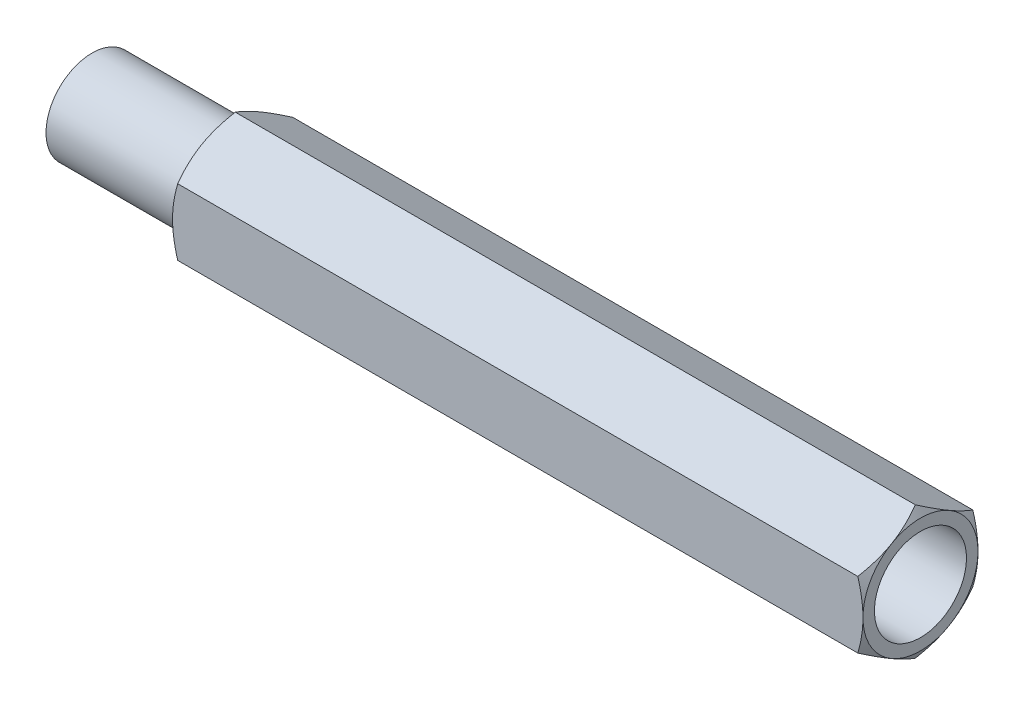
ISO-10303-21;
HEADER;
FILE_DESCRIPTION(('STEP AP214'),'2;1');
FILE_NAME('part.step','',(''),(''),'','','');
FILE_SCHEMA(('AUTOMOTIVE_DESIGN { 1 0 10303 214 1 1 1 1 }'));
ENDSEC;
DATA;
#1=APPLICATION_CONTEXT('core data for automotive mechanical design processes');
#2=APPLICATION_PROTOCOL_DEFINITION('international standard','automotive_design',2000,#1);
#3=PRODUCT_CONTEXT('',#1,'mechanical');
#4=PRODUCT('Part','Part','',(#3));
#5=PRODUCT_RELATED_PRODUCT_CATEGORY('part','',(#4));
#6=PRODUCT_DEFINITION_FORMATION('','',#4);
#7=PRODUCT_DEFINITION_CONTEXT('part definition',#1,'design');
#8=PRODUCT_DEFINITION('design','',#6,#7);
#9=PRODUCT_DEFINITION_SHAPE('','',#8);
#10=(LENGTH_UNIT() NAMED_UNIT(*) SI_UNIT(.MILLI.,.METRE.));
#11=(NAMED_UNIT(*) PLANE_ANGLE_UNIT() SI_UNIT($,.RADIAN.));
#12=(NAMED_UNIT(*) SI_UNIT($,.STERADIAN.) SOLID_ANGLE_UNIT());
#13=UNCERTAINTY_MEASURE_WITH_UNIT(LENGTH_MEASURE(1.E-05),#10,'distance_accuracy_value','');
#14=(GEOMETRIC_REPRESENTATION_CONTEXT(3) GLOBAL_UNCERTAINTY_ASSIGNED_CONTEXT((#13)) GLOBAL_UNIT_ASSIGNED_CONTEXT((#10,
#11,#12)) REPRESENTATION_CONTEXT('',''));
#15=CARTESIAN_POINT('',(0.,0.,0.));
#16=DIRECTION('',(0.,0.,1.));
#17=DIRECTION('',(1.,0.,0.));
#18=AXIS2_PLACEMENT_3D('',#15,#16,#17);
#19=CARTESIAN_POINT('',(6.,1.44337567297408,-2.5));
#20=DIRECTION('',(1.,0.,0.));
#21=DIRECTION('',(0.,0.,-1.));
#22=AXIS2_PLACEMENT_3D('',#19,#20,#21);
#23=PLANE('',#22);
#24=CARTESIAN_POINT('',(6.,0.,0.));
#25=DIRECTION('',(1.,0.,0.));
#26=DIRECTION('',(0.,0.,-1.));
#27=AXIS2_PLACEMENT_3D('',#24,#25,#26);
#28=CIRCLE('',#27,2.5);
#29=CARTESIAN_POINT('',(6.,0.,-2.5));
#30=VERTEX_POINT('',#29);
#31=CARTESIAN_POINT('',(6.,2.1650635094611,-1.24999999999999));
#32=VERTEX_POINT('',#31);
#33=EDGE_CURVE('E267',#30,#32,#28,.T.);
#34=ORIENTED_EDGE('',*,*,#33,.F.);
#35=CARTESIAN_POINT('',(6.,-2.1650635094611,-1.25));
#36=VERTEX_POINT('',#35);
#37=EDGE_CURVE('E268',#36,#30,#28,.T.);
#38=ORIENTED_EDGE('',*,*,#37,.F.);
#39=CARTESIAN_POINT('',(6.,-2.1650635094611,1.25));
#40=VERTEX_POINT('',#39);
#41=EDGE_CURVE('E266',#40,#36,#28,.T.);
#42=ORIENTED_EDGE('',*,*,#41,.F.);
#43=CARTESIAN_POINT('',(6.,0.,2.5));
#44=VERTEX_POINT('',#43);
#45=EDGE_CURVE('E279',#44,#40,#28,.T.);
#46=ORIENTED_EDGE('',*,*,#45,.F.);
#47=CARTESIAN_POINT('',(6.,0.,0.));
#48=DIRECTION('',(-1.,0.,0.));
#49=DIRECTION('',(0.,0.,1.));
#50=AXIS2_PLACEMENT_3D('',#47,#48,#49);
#51=CIRCLE('',#50,2.5);
#52=CARTESIAN_POINT('',(6.,2.1650635094611,1.25));
#53=VERTEX_POINT('',#52);
#54=EDGE_CURVE('E303',#44,#53,#51,.T.);
#55=ORIENTED_EDGE('',*,*,#54,.T.);
#56=EDGE_CURVE('E275',#32,#53,#28,.T.);
#57=ORIENTED_EDGE('',*,*,#56,.F.);
#58=EDGE_LOOP('',(#34,#38,#42,#46,#55,#57));
#59=FACE_BOUND('',#58,.T.);
#60=CARTESIAN_POINT('',(6.,0.,0.));
#61=DIRECTION('',(1.,0.,0.));
#62=DIRECTION('',(0.,0.,-1.));
#63=AXIS2_PLACEMENT_3D('',#60,#61,#62);
#64=CIRCLE('',#63,2.);
#65=CARTESIAN_POINT('',(6.,0.,-2.));
#66=VERTEX_POINT('',#65);
#67=EDGE_CURVE('E11',#66,#66,#64,.F.);
#68=ORIENTED_EDGE('',*,*,#67,.F.);
#69=EDGE_LOOP('',(#68));
#70=FACE_BOUND('',#69,.T.);
#71=ADVANCED_FACE('F40',(#59,#70),#23,.F.);
#72=CARTESIAN_POINT('',(36.,-1.44337567297407,-2.5));
#73=DIRECTION('',(0.,0.,1.));
#74=DIRECTION('',(0.,-1.,0.));
#75=AXIS2_PLACEMENT_3D('',#72,#73,#74);
#76=PLANE('',#75);
#77=CARTESIAN_POINT('',(34.7508787691137,-3.93682851187262,-2.5));
#78=CARTESIAN_POINT('',(34.8043404567659,-3.82710818909763,-2.5));
#79=CARTESIAN_POINT('',(34.8573064813436,-3.71714229485296,-2.5));
#80=CARTESIAN_POINT('',(34.9619695344395,-3.49658896480046,-2.5));
#81=CARTESIAN_POINT('',(35.0136663739622,-3.3860014394022,-2.5));
#82=CARTESIAN_POINT('',(35.115760761975,-3.16353296518395,-2.5));
#83=CARTESIAN_POINT('',(35.1661502063801,-3.05164828484383,-2.5));
#84=CARTESIAN_POINT('',(35.264944892168,-2.82700953689334,-2.5));
#85=CARTESIAN_POINT('',(35.3133502235222,-2.71425550898044,-2.5));
#86=CARTESIAN_POINT('',(35.409250530731,-2.48386509338641,-2.5));
#87=CARTESIAN_POINT('',(35.4566592576203,-2.36619261390428,-2.5));
#88=CARTESIAN_POINT('',(35.5480311496517,-2.12949325098224,-2.5));
#89=CARTESIAN_POINT('',(35.5919939367007,-2.01046622055543,-2.5));
#90=CARTESIAN_POINT('',(35.675363617727,-1.77107239298566,-2.5));
#91=CARTESIAN_POINT('',(35.7147792341367,-1.65070866329632,-2.5));
#92=CARTESIAN_POINT('',(35.787829554951,-1.40825562875043,-2.5));
#93=CARTESIAN_POINT('',(35.821466017572,-1.28616686098639,-2.5));
#94=CARTESIAN_POINT('',(35.881205191497,-1.0408697817303,-2.5));
#95=CARTESIAN_POINT('',(35.9073500479934,-0.917671922372913,-2.5));
#96=CARTESIAN_POINT('',(35.9506668258636,-0.669683589080242,-2.5));
#97=CARTESIAN_POINT('',(35.9678397230119,-0.544893289848821,-2.5));
#98=CARTESIAN_POINT('',(35.9916208578148,-0.295997325613061,-2.5));
#99=CARTESIAN_POINT('',(35.9983695673072,-0.171905422417135,-2.5));
#100=CARTESIAN_POINT('',(36.0011039761235,0.0764102585415243,-2.5));
#101=CARTESIAN_POINT('',(35.9970895167612,0.200634038221578,-2.5));
#102=CARTESIAN_POINT('',(35.9815599959649,0.409769808352732,-2.5));
#103=CARTESIAN_POINT('',(35.9727646525366,0.494897467609097,-2.5));
#104=CARTESIAN_POINT('',(35.9506354089981,0.664564693702991,-2.5));
#105=CARTESIAN_POINT('',(35.9373009427098,0.749104185833703,-2.5));
#106=CARTESIAN_POINT('',(35.8911861462596,1.00170586449879,-2.5));
#107=CARTESIAN_POINT('',(35.8523014542741,1.16866798504123,-2.5));
#108=CARTESIAN_POINT('',(35.7844155339125,1.41845743278139,-2.5));
#109=CARTESIAN_POINT('',(35.7598568023056,1.50256614631934,-2.5));
#110=CARTESIAN_POINT('',(35.708075553247,1.6699675205386,-2.5));
#111=CARTESIAN_POINT('',(35.6808530152469,1.75326017491942,-2.49999999999999));
#112=CARTESIAN_POINT('',(35.6241903573808,1.91905463328519,-2.49999999999999));
#113=CARTESIAN_POINT('',(35.5947508613032,2.00155665242186,-2.49999999999999));
#114=CARTESIAN_POINT('',(35.5340119127324,2.16586873031761,-2.49999999999999));
#115=CARTESIAN_POINT('',(35.5027125029679,2.24767880492379,-2.49999999999999));
#116=CARTESIAN_POINT('',(35.4160096449457,2.4679917892095,-2.49999999999999));
#117=CARTESIAN_POINT('',(35.3591311532434,2.60591366383172,-2.49999999999999));
#118=CARTESIAN_POINT('',(35.2420273288296,2.88033446959211,-2.49999999999999));
#119=CARTESIAN_POINT('',(35.1818016232289,3.01683324017273,-2.49999999999999));
#120=CARTESIAN_POINT('',(35.0587995600523,3.28873049385052,-2.49999999999999));
#121=CARTESIAN_POINT('',(34.9960223163594,3.42412857476063,-2.49999999999999));
#122=CARTESIAN_POINT('',(34.868517492058,3.69400504169936,-2.49999999999999));
#123=CARTESIAN_POINT('',(34.8037898513421,3.82848339922683,-2.49999999999999));
#124=CARTESIAN_POINT('',(34.6071430409521,4.23123577525371,-2.49999999999999));
#125=CARTESIAN_POINT('',(34.472956234217,4.49840113812902,-2.49999999999999));
#126=CARTESIAN_POINT('',(34.200798503918,5.03071112955916,-2.49999999999999));
#127=CARTESIAN_POINT('',(34.0628283826684,5.29585617154695,-2.49999999999999));
#128=CARTESIAN_POINT('',(33.7990641263008,5.79675686803829,-2.49999999999999));
#129=CARTESIAN_POINT('',(33.6735291788985,6.03264924061411,-2.49999999999999));
#130=CARTESIAN_POINT('',(33.4209486180911,6.50364132654159,-2.49999999999999));
#131=CARTESIAN_POINT('',(33.2939029113505,6.73874098975548,-2.49999999999999));
#132=CARTESIAN_POINT('',(33.0391210110359,7.20754017895845,-2.49999999999999));
#133=CARTESIAN_POINT('',(32.9113885830859,7.44124175390128,-2.49999999999999));
#134=CARTESIAN_POINT('',(32.6550655132235,7.90814984607043,-2.49999999999999));
#135=CARTESIAN_POINT('',(32.5264749402216,8.14135640111172,-2.49999999999999));
#136=CARTESIAN_POINT('',(32.3975723438962,8.37438915427277,-2.49999999999999));
#137=B_SPLINE_CURVE_WITH_KNOTS('',3,(#77,#78,#79,#80,#81,#82,#83,#84,#85,#86,#87,#88,#89,#90,
#91,#92,#93,#94,#95,#96,#97,#98,#99,#100,#101,#102,#103,#104,#105,#106,#107,#108,#109,#110,#111,
#112,#113,#114,#115,#116,#117,#118,#119,#120,#121,#122,#123,#124,#125,#126,#127,#128,#129,#130,
#131,#132,#133,#134,#135,#136),.UNSPECIFIED.,.F.,.F.,(4,2,2,2,2,2,2,2,2,2,2,2,2,2,2,2,2,2,2,2,2,
2,2,2,2,2,2,2,2,4),(0.,0.366160325892052,0.732374850327399,1.10048369240865,1.46857582373929,
1.84912519359739,2.22971625955537,2.60956468599492,2.98929734412778,3.36684982144535,
3.74436122826867,4.11673964760972,4.48912355711763,4.74574269795127,5.00239385938625,
5.51594573005896,5.77878421499915,6.04162472762437,6.30439155881506,6.5671523556674,
7.01465571548672,7.46220902877876,7.90991912245572,8.35764302784629,9.25449744046324,
10.1511631091372,10.9528027044398,11.7544920854069,12.5534819307734,13.3524083699507),.UNSPECIFIED.);
#138=CARTESIAN_POINT('',(35.7767090063074,-1.44337567297407,-2.5));
#139=VERTEX_POINT('',#138);
#140=CARTESIAN_POINT('',(36.,0.,-2.5));
#141=VERTEX_POINT('',#140);
#142=EDGE_CURVE('E304',#139,#141,#137,.T.);
#143=ORIENTED_EDGE('',*,*,#142,.F.);
#144=DIRECTION('',(-1.,0.,0.));
#145=VECTOR('',#144,1.);
#146=CARTESIAN_POINT('',(36.,-1.44337567297407,-2.5));
#147=LINE('',#146,#145);
#148=CARTESIAN_POINT('',(6.2232909936926,-1.44337567297407,-2.5));
#149=VERTEX_POINT('',#148);
#150=EDGE_CURVE('E253',#139,#149,#147,.T.);
#151=ORIENTED_EDGE('',*,*,#150,.T.);
#152=CARTESIAN_POINT('',(7.24912123088631,-3.93682851187262,-2.5));
#153=CARTESIAN_POINT('',(7.19565954323411,-3.82710818909763,-2.5));
#154=CARTESIAN_POINT('',(7.14269351865644,-3.71714229485297,-2.5));
#155=CARTESIAN_POINT('',(7.03803046556053,-3.49658896480046,-2.5));
#156=CARTESIAN_POINT('',(6.98633362603778,-3.3860014394022,-2.5));
#157=CARTESIAN_POINT('',(6.88423923802502,-3.16353296518396,-2.5));
#158=CARTESIAN_POINT('',(6.8338497936199,-3.05164828484383,-2.5));
#159=CARTESIAN_POINT('',(6.735055107832,-2.82700953689334,-2.5));
#160=CARTESIAN_POINT('',(6.68664977647774,-2.71425550898045,-2.5));
#161=CARTESIAN_POINT('',(6.59074946926901,-2.48386509338642,-2.5));
#162=CARTESIAN_POINT('',(6.54334074237968,-2.36619261390429,-2.5));
#163=CARTESIAN_POINT('',(6.45196885034827,-2.12949325098224,-2.5));
#164=CARTESIAN_POINT('',(6.40800606329925,-2.01046622055544,-2.5));
#165=CARTESIAN_POINT('',(6.32463638227302,-1.77107239298566,-2.5));
#166=CARTESIAN_POINT('',(6.28522076586331,-1.65070866329632,-2.5));
#167=CARTESIAN_POINT('',(6.21217044504895,-1.40825562875043,-2.5));
#168=CARTESIAN_POINT('',(6.17853398242803,-1.28616686098639,-2.5));
#169=CARTESIAN_POINT('',(6.11879480850298,-1.0408697817303,-2.5));
#170=CARTESIAN_POINT('',(6.09264995200663,-0.917671922372913,-2.5));
#171=CARTESIAN_POINT('',(6.04933317413643,-0.669683589080243,-2.5));
#172=CARTESIAN_POINT('',(6.0321602769881,-0.544893289848822,-2.5));
#173=CARTESIAN_POINT('',(6.00837914218523,-0.295997325613063,-2.5));
#174=CARTESIAN_POINT('',(6.00163043269274,-0.171905422417137,-2.5));
#175=CARTESIAN_POINT('',(5.9988960238765,0.0764102585415225,-2.5));
#176=CARTESIAN_POINT('',(6.00291048323881,0.200634038221577,-2.5));
#177=CARTESIAN_POINT('',(6.01844000403505,0.40976980835273,-2.5));
#178=CARTESIAN_POINT('',(6.02723534746341,0.494897467609095,-2.5));
#179=CARTESIAN_POINT('',(6.04936459100185,0.66456469370299,-2.5));
#180=CARTESIAN_POINT('',(6.06269905729015,0.749104185833701,-2.5));
#181=CARTESIAN_POINT('',(6.10881385374036,1.00170586449879,-2.5));
#182=CARTESIAN_POINT('',(6.14769854572585,1.16866798504122,-2.5));
#183=CARTESIAN_POINT('',(6.21558446608752,1.41845743278139,-2.5));
#184=CARTESIAN_POINT('',(6.24014319769442,1.50256614631933,-2.5));
#185=CARTESIAN_POINT('',(6.29192444675296,1.6699675205386,-2.5));
#186=CARTESIAN_POINT('',(6.31914698475308,1.75326017491942,-2.49999999999999));
#187=CARTESIAN_POINT('',(6.37580964261923,1.91905463328519,-2.49999999999999));
#188=CARTESIAN_POINT('',(6.40524913869675,2.00155665242186,-2.49999999999999));
#189=CARTESIAN_POINT('',(6.46598808726755,2.16586873031761,-2.49999999999999));
#190=CARTESIAN_POINT('',(6.49728749703213,2.24767880492379,-2.49999999999999));
#191=CARTESIAN_POINT('',(6.58399035505426,2.4679917892095,-2.49999999999999));
#192=CARTESIAN_POINT('',(6.64086884675663,2.60591366383172,-2.49999999999999));
#193=CARTESIAN_POINT('',(6.75797267117043,2.88033446959211,-2.49999999999999));
#194=CARTESIAN_POINT('',(6.81819837677106,3.01683324017274,-2.49999999999999));
#195=CARTESIAN_POINT('',(6.94120043994772,3.28873049385052,-2.49999999999999));
#196=CARTESIAN_POINT('',(7.00397768364063,3.42412857476063,-2.49999999999999));
#197=CARTESIAN_POINT('',(7.13148250794196,3.69400504169936,-2.49999999999999));
#198=CARTESIAN_POINT('',(7.1962101486579,3.82848339922683,-2.49999999999999));
#199=CARTESIAN_POINT('',(7.39285695904792,4.23123577525371,-2.49999999999999));
#200=CARTESIAN_POINT('',(7.52704376578296,4.49840113812902,-2.49999999999999));
#201=CARTESIAN_POINT('',(7.79920149608202,5.03071112955915,-2.49999999999999));
#202=CARTESIAN_POINT('',(7.93717161733164,5.29585617154695,-2.49999999999999));
#203=CARTESIAN_POINT('',(8.20093587369918,5.79675686803829,-2.49999999999999));
#204=CARTESIAN_POINT('',(8.32647082110146,6.03264924061411,-2.49999999999999));
#205=CARTESIAN_POINT('',(8.57905138190891,6.50364132654159,-2.49999999999999));
#206=CARTESIAN_POINT('',(8.70609708864949,6.73874098975547,-2.49999999999999));
#207=CARTESIAN_POINT('',(8.9608789889641,7.20754017895844,-2.49999999999999));
#208=CARTESIAN_POINT('',(9.08861141691406,7.44124175390128,-2.49999999999999));
#209=CARTESIAN_POINT('',(9.34493448677647,7.90814984607042,-2.49999999999999));
#210=CARTESIAN_POINT('',(9.4735250597784,8.14135640111172,-2.49999999999999));
#211=CARTESIAN_POINT('',(9.60242765610383,8.37438915427277,-2.49999999999999));
#212=B_SPLINE_CURVE_WITH_KNOTS('',3,(#152,#153,#154,#155,#156,#157,#158,#159,#160,#161,#162,
#163,#164,#165,#166,#167,#168,#169,#170,#171,#172,#173,#174,#175,#176,#177,#178,#179,#180,#181,
#182,#183,#184,#185,#186,#187,#188,#189,#190,#191,#192,#193,#194,#195,#196,#197,#198,#199,#200,
#201,#202,#203,#204,#205,#206,#207,#208,#209,#210,#211),.UNSPECIFIED.,.F.,.F.,(4,2,2,2,2,2,2,2,
2,2,2,2,2,2,2,2,2,2,2,2,2,2,2,2,2,2,2,2,2,4),(0.,0.36616032589205,0.732374850327399,
1.10048369240865,1.46857582373929,1.84912519359739,2.22971625955537,2.60956468599492,
2.98929734412778,3.36684982144535,3.74436122826867,4.11673964760972,4.48912355711763,
4.74574269795127,5.00239385938625,5.51594573005896,5.77878421499915,6.04162472762437,
6.30439155881506,6.5671523556674,7.01465571548672,7.46220902877876,7.90991912245572,
8.35764302784629,9.25449744046324,10.1511631091372,10.9528027044398,11.7544920854069,
12.5534819307734,13.3524083699507),.UNSPECIFIED.);
#213=EDGE_CURVE('E234',#30,#149,#212,.F.);
#214=ORIENTED_EDGE('',*,*,#213,.F.);
#215=CARTESIAN_POINT('',(6.2232909936926,1.44337567297408,-2.5));
#216=VERTEX_POINT('',#215);
#217=EDGE_CURVE('E476',#216,#30,#212,.F.);
#218=ORIENTED_EDGE('',*,*,#217,.F.);
#219=DIRECTION('',(-1.,0.,0.));
#220=VECTOR('',#219,1.);
#221=CARTESIAN_POINT('',(36.,1.44337567297408,-2.5));
#222=LINE('',#221,#220);
#223=CARTESIAN_POINT('',(35.7767090063074,1.44337567297408,-2.5));
#224=VERTEX_POINT('',#223);
#225=EDGE_CURVE('E263',#224,#216,#222,.T.);
#226=ORIENTED_EDGE('',*,*,#225,.F.);
#227=EDGE_CURVE('E131',#141,#224,#137,.T.);
#228=ORIENTED_EDGE('',*,*,#227,.F.);
#229=EDGE_LOOP('',(#143,#151,#214,#218,#226,#228));
#230=FACE_BOUND('',#229,.T.);
#231=ADVANCED_FACE('F39',(#230),#76,.F.);
#232=CARTESIAN_POINT('',(36.,1.44337567297408,-2.5));
#233=DIRECTION('',(0.,-0.86602540378444,0.499999999999997));
#234=DIRECTION('',(0.,-0.499999999999997,-0.86602540378444));
#235=AXIS2_PLACEMENT_3D('',#232,#233,#234);
#236=PLANE('',#235);
#237=CARTESIAN_POINT('',(35.7766423356409,1.44326020292024,-2.5002));
#238=CARTESIAN_POINT('',(35.8132783798924,1.50668977106846,-2.39033676526513));
#239=CARTESIAN_POINT('',(35.8465977810349,1.57066685804386,-2.27952520010347));
#240=CARTESIAN_POINT('',(35.9047577144421,1.69972891130043,-2.05598316653395));
#241=CARTESIAN_POINT('',(35.9295776708522,1.76481617119471,-1.94324872547161));
#242=CARTESIAN_POINT('',(35.9682143485589,1.89418403867741,-1.71917700612472));
#243=CARTESIAN_POINT('',(35.9822882038144,1.95844473900198,-1.60787420823261));
#244=CARTESIAN_POINT('',(35.9990908476472,2.08726857876806,-1.38474477253166));
#245=CARTESIAN_POINT('',(36.0018335487964,2.15183124982668,-1.27291894598576));
#246=CARTESIAN_POINT('',(35.9961342399919,2.27247489412635,-1.06395802444847));
#247=CARTESIAN_POINT('',(35.9890916056181,2.3285739078398,-0.966791682442262));
#248=CARTESIAN_POINT('',(35.966768580875,2.44040644260542,-0.773092050288993));
#249=CARTESIAN_POINT('',(35.9514805615597,2.4961395767184,-0.676559430340264));
#250=CARTESIAN_POINT('',(35.9132609061556,2.60820277442169,-0.482460278259522));
#251=CARTESIAN_POINT('',(35.8901672238745,2.66451865130903,-0.384918318217858));
#252=CARTESIAN_POINT('',(35.8377533434221,2.77631036402774,-0.191289391923915));
#253=CARTESIAN_POINT('',(35.8084454643755,2.83178763258717,-0.0951999441138247));
#254=CARTESIAN_POINT('',(35.7766423356409,2.88686681600197,0.000199999999997675));
#255=B_SPLINE_CURVE_WITH_KNOTS('',3,(#237,#238,#239,#240,#241,#242,#243,#244,#245,#246,#247,
#248,#249,#250,#251,#252,#253,#254),.UNSPECIFIED.,.F.,.F.,(4,2,2,2,2,2,2,2,4),(0.,
0.396285827362226,0.793524330152052,1.18093086852114,1.56786160134476,1.90479741793733,
2.24204551660462,2.58677531536755,2.93082800105255),.UNSPECIFIED.);
#256=CARTESIAN_POINT('',(36.,2.1650635094611,-1.24999999999999));
#257=VERTEX_POINT('',#256);
#258=EDGE_CURVE('E129',#224,#257,#255,.T.);
#259=ORIENTED_EDGE('',*,*,#258,.F.);
#260=ORIENTED_EDGE('',*,*,#225,.T.);
#261=CARTESIAN_POINT('',(6.2233576643591,2.88686681600197,0.000199999999998128));
#262=CARTESIAN_POINT('',(6.18672162010762,2.82343724785374,-0.109663234734873));
#263=CARTESIAN_POINT('',(6.15340221896505,2.75946016087834,-0.220474799896528));
#264=CARTESIAN_POINT('',(6.09524228555786,2.63039810762178,-0.444016833466052));
#265=CARTESIAN_POINT('',(6.07042232914774,2.5653108477275,-0.556751274528391));
#266=CARTESIAN_POINT('',(6.03178565144105,2.43594298024479,-0.780822993875272));
#267=CARTESIAN_POINT('',(6.01771179618564,2.37168227992023,-0.89212579176738));
#268=CARTESIAN_POINT('',(6.00090915235275,2.24285844015415,-1.11525522746834));
#269=CARTESIAN_POINT('',(5.99816645120363,2.17829576909553,-1.22708105401423));
#270=CARTESIAN_POINT('',(6.00386576000805,2.05765212479586,-1.43604197555152));
#271=CARTESIAN_POINT('',(6.01090839438186,2.0015531110824,-1.53320831755773));
#272=CARTESIAN_POINT('',(6.03323141912494,1.88972057631678,-1.726907949711));
#273=CARTESIAN_POINT('',(6.04851943844027,1.83398744220381,-1.82344056965973));
#274=CARTESIAN_POINT('',(6.08673909384442,1.72192424450051,-2.01753972174047));
#275=CARTESIAN_POINT('',(6.10983277612552,1.66560836761317,-2.11508168178214));
#276=CARTESIAN_POINT('',(6.16224665657791,1.55381665489447,-2.30871060807608));
#277=CARTESIAN_POINT('',(6.19155453562455,1.49833938633503,-2.40480005588617));
#278=CARTESIAN_POINT('',(6.22335766435911,1.44326020292024,-2.5002));
#279=B_SPLINE_CURVE_WITH_KNOTS('',3,(#261,#262,#263,#264,#265,#266,#267,#268,#269,#270,#271,
#272,#273,#274,#275,#276,#277,#278),.UNSPECIFIED.,.F.,.F.,(4,2,2,2,2,2,2,2,4),(0.,
0.396285827362226,0.79352433015205,1.18093086852114,1.56786160134475,1.90479741793733,
2.24204551660462,2.58677531536755,2.93082800105255),.UNSPECIFIED.);
#280=EDGE_CURVE('E233',#32,#216,#279,.T.);
#281=ORIENTED_EDGE('',*,*,#280,.F.);
#282=CARTESIAN_POINT('',(6.2232909936926,2.88675134594813,0.));
#283=VERTEX_POINT('',#282);
#284=EDGE_CURVE('E246',#283,#32,#279,.T.);
#285=ORIENTED_EDGE('',*,*,#284,.F.);
#286=DIRECTION('',(-1.,0.,0.));
#287=VECTOR('',#286,1.);
#288=CARTESIAN_POINT('',(36.,2.88675134594813,0.));
#289=LINE('',#288,#287);
#290=CARTESIAN_POINT('',(35.7767090063074,2.88675134594813,0.));
#291=VERTEX_POINT('',#290);
#292=EDGE_CURVE('E153',#291,#283,#289,.T.);
#293=ORIENTED_EDGE('',*,*,#292,.F.);
#294=EDGE_CURVE('E135',#257,#291,#255,.T.);
#295=ORIENTED_EDGE('',*,*,#294,.F.);
#296=EDGE_LOOP('',(#259,#260,#281,#285,#293,#295));
#297=FACE_BOUND('',#296,.T.);
#298=ADVANCED_FACE('F152',(#297),#236,.F.);
#299=CARTESIAN_POINT('',(36.,2.88675134594813,0.));
#300=DIRECTION('',(0.,-0.866025403784439,-0.499999999999999));
#301=DIRECTION('',(0.,0.499999999999999,-0.86602540378444));
#302=AXIS2_PLACEMENT_3D('',#299,#300,#301);
#303=PLANE('',#302);
#304=CARTESIAN_POINT('',(35.7766423356409,2.88686681600197,-0.000200000000001253));
#305=CARTESIAN_POINT('',(35.8132783798924,2.82343724785374,0.10966323473487));
#306=CARTESIAN_POINT('',(35.8465977810349,2.75946016087834,0.220474799896524));
#307=CARTESIAN_POINT('',(35.9047577144421,2.63039810762178,0.444016833466048));
#308=CARTESIAN_POINT('',(35.9295776708523,2.5653108477275,0.556751274528386));
#309=CARTESIAN_POINT('',(35.9682143485589,2.43594298024479,0.780822993875266));
#310=CARTESIAN_POINT('',(35.9822882038144,2.37168227992023,0.892125791767374));
#311=CARTESIAN_POINT('',(35.9990908476472,2.24285844015415,1.11525522746833));
#312=CARTESIAN_POINT('',(36.0018335487964,2.17829576909553,1.22708105401422));
#313=CARTESIAN_POINT('',(35.9961342399919,2.05765212479586,1.43604197555152));
#314=CARTESIAN_POINT('',(35.9890916056181,2.0015531110824,1.53320831755773));
#315=CARTESIAN_POINT('',(35.966768580875,1.88972057631678,1.726907949711));
#316=CARTESIAN_POINT('',(35.9514805615597,1.8339874422038,1.82344056965973));
#317=CARTESIAN_POINT('',(35.9132609061556,1.7219242445005,2.01753972174048));
#318=CARTESIAN_POINT('',(35.8901672238745,1.66560836761316,2.11508168178214));
#319=CARTESIAN_POINT('',(35.8377533434221,1.55381665489446,2.30871060807609));
#320=CARTESIAN_POINT('',(35.8084454643754,1.49833938633502,2.40480005588618));
#321=CARTESIAN_POINT('',(35.7766423356409,1.44326020292023,2.5002));
#322=B_SPLINE_CURVE_WITH_KNOTS('',3,(#304,#305,#306,#307,#308,#309,#310,#311,#312,#313,#314,
#315,#316,#317,#318,#319,#320,#321),.UNSPECIFIED.,.F.,.F.,(4,2,2,2,2,2,2,2,4),(0.,
0.396285827362226,0.793524330152048,1.18093086852114,1.56786160134475,1.90479741793733,
2.24204551660463,2.58677531536756,2.93082800105257),.UNSPECIFIED.);
#323=CARTESIAN_POINT('',(36.,2.1650635094611,1.25));
#324=VERTEX_POINT('',#323);
#325=EDGE_CURVE('E142',#291,#324,#322,.T.);
#326=ORIENTED_EDGE('',*,*,#325,.F.);
#327=ORIENTED_EDGE('',*,*,#292,.T.);
#328=CARTESIAN_POINT('',(6.22335766435911,1.44326020292023,2.5002));
#329=CARTESIAN_POINT('',(6.18672162010762,1.50668977106845,2.39033676526513));
#330=CARTESIAN_POINT('',(6.15340221896505,1.57066685804385,2.27952520010348));
#331=CARTESIAN_POINT('',(6.09524228555786,1.69972891130041,2.05598316653395));
#332=CARTESIAN_POINT('',(6.07042232914774,1.7648161711947,1.94324872547161));
#333=CARTESIAN_POINT('',(6.03178565144105,1.8941840386774,1.71917700612473));
#334=CARTESIAN_POINT('',(6.01771179618564,1.95844473900197,1.60787420823262));
#335=CARTESIAN_POINT('',(6.00090915235275,2.08726857876804,1.38474477253167));
#336=CARTESIAN_POINT('',(5.99816645120362,2.15183124982667,1.27291894598577));
#337=CARTESIAN_POINT('',(6.00386576000805,2.27247489412634,1.06395802444848));
#338=CARTESIAN_POINT('',(6.01090839438186,2.32857390783979,0.966791682442269));
#339=CARTESIAN_POINT('',(6.03323141912494,2.44040644260542,0.773092050288998));
#340=CARTESIAN_POINT('',(6.04851943844026,2.49613957671839,0.676559430340268));
#341=CARTESIAN_POINT('',(6.08673909384442,2.60820277442169,0.482460278259524));
#342=CARTESIAN_POINT('',(6.10983277612551,2.66451865130903,0.384918318217859));
#343=CARTESIAN_POINT('',(6.16224665657791,2.77631036402774,0.191289391923913));
#344=CARTESIAN_POINT('',(6.19155453562454,2.83178763258717,0.0951999441138222));
#345=CARTESIAN_POINT('',(6.2233576643591,2.88686681600197,-0.000200000000002017));
#346=B_SPLINE_CURVE_WITH_KNOTS('',3,(#328,#329,#330,#331,#332,#333,#334,#335,#336,#337,#338,
#339,#340,#341,#342,#343,#344,#345),.UNSPECIFIED.,.F.,.F.,(4,2,2,2,2,2,2,2,4),(0.,
0.396285827362227,0.793524330152051,1.18093086852114,1.56786160134475,1.90479741793733,
2.24204551660463,2.58677531536756,2.93082800105257),.UNSPECIFIED.);
#347=EDGE_CURVE('E250',#53,#283,#346,.T.);
#348=ORIENTED_EDGE('',*,*,#347,.F.);
#349=CARTESIAN_POINT('',(6.2232909936926,1.44337567297407,2.5));
#350=VERTEX_POINT('',#349);
#351=EDGE_CURVE('E251',#350,#53,#346,.T.);
#352=ORIENTED_EDGE('',*,*,#351,.F.);
#353=DIRECTION('',(-1.,0.,0.));
#354=VECTOR('',#353,1.);
#355=CARTESIAN_POINT('',(36.,1.44337567297407,2.5));
#356=LINE('',#355,#354);
#357=CARTESIAN_POINT('',(35.7767090063074,1.44337567297407,2.5));
#358=VERTEX_POINT('',#357);
#359=EDGE_CURVE('E261',#358,#350,#356,.T.);
#360=ORIENTED_EDGE('',*,*,#359,.F.);
#361=EDGE_CURVE('E155',#324,#358,#322,.T.);
#362=ORIENTED_EDGE('',*,*,#361,.F.);
#363=EDGE_LOOP('',(#326,#327,#348,#352,#360,#362));
#364=FACE_BOUND('',#363,.T.);
#365=ADVANCED_FACE('F219',(#364),#303,.F.);
#366=CARTESIAN_POINT('',(36.,1.44337567297407,2.5));
#367=DIRECTION('',(0.,0.,-1.));
#368=DIRECTION('',(-1.,0.,0.));
#369=AXIS2_PLACEMENT_3D('',#366,#367,#368);
#370=PLANE('',#369);
#371=CARTESIAN_POINT('',(34.7508787703001,-3.93682850943836,2.5));
#372=CARTESIAN_POINT('',(34.8043404579029,-3.82710818674533,2.5));
#373=CARTESIAN_POINT('',(34.8573064824311,-3.71714229258269,2.5));
#374=CARTESIAN_POINT('',(34.9619695354285,-3.49658896269448,2.5));
#375=CARTESIAN_POINT('',(35.013666374902,-3.38600143737849,2.5));
#376=CARTESIAN_POINT('',(35.1157607628164,-3.16353296332602,2.5));
#377=CARTESIAN_POINT('',(35.1661502071724,-3.0516482830694,2.5));
#378=CARTESIAN_POINT('',(35.2649448928627,-2.8270095352865,2.5));
#379=CARTESIAN_POINT('',(35.3133502241686,-2.71425550745768,2.5));
#380=CARTESIAN_POINT('',(35.4092505312791,-2.48386509203846,2.5));
#381=CARTESIAN_POINT('',(35.4566592581187,-2.36619261264713,2.5));
#382=CARTESIAN_POINT('',(35.5480311500532,-2.12949324990812,2.5));
#383=CARTESIAN_POINT('',(35.5919939370552,-2.01046621957356,2.5));
#384=CARTESIAN_POINT('',(35.6753636179916,-1.77107239218998,2.5));
#385=CARTESIAN_POINT('',(35.7147792343587,-1.65070866259458,2.5));
#386=CARTESIAN_POINT('',(35.7878295550946,-1.40825562823912,2.5));
#387=CARTESIAN_POINT('',(35.8214660176797,-1.28616686057156,2.5));
#388=CARTESIAN_POINT('',(35.8812051915324,-1.04086978155746,2.5));
#389=CARTESIAN_POINT('',(35.907350047995,-0.917671922346257,2.5));
#390=CARTESIAN_POINT('',(35.9506668258195,-0.669683589349525,2.5));
#391=CARTESIAN_POINT('',(35.967839722956,-0.54489329026786,2.5));
#392=CARTESIAN_POINT('',(35.9916208577619,-0.295997326329171,2.5));
#393=CARTESIAN_POINT('',(35.9983695672688,-0.171905423280525,2.5));
#394=CARTESIAN_POINT('',(36.0011039761397,0.0764102573857547,2.5));
#395=CARTESIAN_POINT('',(35.9970895168176,0.20063403692071,2.5));
#396=CARTESIAN_POINT('',(35.9815599961028,0.409769806870476,2.5));
#397=CARTESIAN_POINT('',(35.9727646527066,0.494897466088904,2.5));
#398=CARTESIAN_POINT('',(35.9506354092343,0.664564692108647,2.5));
#399=CARTESIAN_POINT('',(35.9373009429799,0.749104184203143,2.5));
#400=CARTESIAN_POINT('',(35.8911861466321,1.0017058627616,2.5));
#401=CARTESIAN_POINT('',(35.8523014547157,1.1686679832358,2.5));
#402=CARTESIAN_POINT('',(35.784415534456,1.41845743087392,2.5));
#403=CARTESIAN_POINT('',(35.7598568028833,1.5025661443771,2.5));
#404=CARTESIAN_POINT('',(35.7080755538922,1.66996751852724,2.5));
#405=CARTESIAN_POINT('',(35.6808530159252,1.75326017287369,2.5));
#406=CARTESIAN_POINT('',(35.6241903581242,1.91905463117101,2.5));
#407=CARTESIAN_POINT('',(35.5947508620786,2.00155665027358,2.5));
#408=CARTESIAN_POINT('',(35.5340119135705,2.16586872810113,2.5));
#409=CARTESIAN_POINT('',(35.5027125038367,2.2476788026732,2.5));
#410=CARTESIAN_POINT('',(35.4160096458677,2.46799178693974,2.5));
#411=CARTESIAN_POINT('',(35.3591311541842,2.60591366157588,2.5));
#412=CARTESIAN_POINT('',(35.2420273298028,2.88033446736231,2.5));
#413=CARTESIAN_POINT('',(35.1818016242156,3.01683323795505,2.5));
#414=CARTESIAN_POINT('',(35.0587995610618,3.28873049165575,2.5));
#415=CARTESIAN_POINT('',(34.9960223173783,3.42412857257667,2.5));
#416=CARTESIAN_POINT('',(34.868517493093,3.69400503953587,2.5));
#417=CARTESIAN_POINT('',(34.8037898523837,3.828483397073,2.5));
#418=CARTESIAN_POINT('',(34.6071430420099,4.23123577312875,2.5));
#419=CARTESIAN_POINT('',(34.4729562352814,4.49840113602192,2.5));
#420=CARTESIAN_POINT('',(34.200798504991,5.03071112748543,2.5));
#421=CARTESIAN_POINT('',(34.0628283837436,5.29585616948874,2.5));
#422=CARTESIAN_POINT('',(33.7990641273842,5.79675686599544,2.5));
#423=CARTESIAN_POINT('',(33.6735291799884,6.0326492385713,2.5));
#424=CARTESIAN_POINT('',(33.4209486191925,6.50364132449826,2.5));
#425=CARTESIAN_POINT('',(33.2939029124571,6.73874098771158,2.5));
#426=CARTESIAN_POINT('',(33.039121012153,7.20754017691078,2.5));
#427=CARTESIAN_POINT('',(32.9113885842085,7.44124175185042,2.5));
#428=CARTESIAN_POINT('',(32.6550655143564,7.9081498440128,2.5));
#429=CARTESIAN_POINT('',(32.5264749413593,8.14135639905052,2.5));
#430=CARTESIAN_POINT('',(32.3975723450385,8.37438915220788,2.5));
#431=B_SPLINE_CURVE_WITH_KNOTS('',3,(#371,#372,#373,#374,#375,#376,#377,#378,#379,#380,#381,
#382,#383,#384,#385,#386,#387,#388,#389,#390,#391,#392,#393,#394,#395,#396,#397,#398,#399,#400,
#401,#402,#403,#404,#405,#406,#407,#408,#409,#410,#411,#412,#413,#414,#415,#416,#417,#418,#419,
#420,#421,#422,#423,#424,#425,#426,#427,#428,#429,#430),.UNSPECIFIED.,.F.,.F.,(4,2,2,2,2,2,2,2,
2,2,2,2,2,2,2,2,2,2,2,2,2,2,2,2,2,2,2,2,2,4),(0.,0.366160325606036,0.732374849755333,
1.10048369154756,1.46857582258919,1.84912519213889,2.22971625778837,2.60956468392041,
2.989297341746,3.36684981861448,3.74436122498938,4.11673964389328,4.48912355296385,
4.74574269367438,5.00239385498623,5.51594572541216,5.77878421022341,6.0416247227197,
6.3043915537818,6.56715235050554,7.0146557103416,7.46220902365056,7.90991911734496,
8.35764302275302,9.25449743540889,10.1511631041212,10.9528026994147,11.7544920803731,
12.5534819257233,13.3524083648842),.UNSPECIFIED.);
#432=CARTESIAN_POINT('',(36.,0.,2.5));
#433=VERTEX_POINT('',#432);
#434=EDGE_CURVE('E214',#358,#433,#431,.F.);
#435=ORIENTED_EDGE('',*,*,#434,.F.);
#436=ORIENTED_EDGE('',*,*,#359,.T.);
#437=CARTESIAN_POINT('',(7.24912122969989,-3.93682850943835,2.5));
#438=CARTESIAN_POINT('',(7.19565954209712,-3.82710818674533,2.5));
#439=CARTESIAN_POINT('',(7.14269351756886,-3.71714229258269,2.5));
#440=CARTESIAN_POINT('',(7.03803046457152,-3.49658896269448,2.5));
#441=CARTESIAN_POINT('',(6.98633362509794,-3.38600143737849,2.5));
#442=CARTESIAN_POINT('',(6.88423923718354,-3.16353296332602,2.5));
#443=CARTESIAN_POINT('',(6.8338497928276,-3.0516482830694,2.5));
#444=CARTESIAN_POINT('',(6.73505510713726,-2.8270095352865,2.5));
#445=CARTESIAN_POINT('',(6.68664977583137,-2.71425550745768,2.5));
#446=CARTESIAN_POINT('',(6.59074946872087,-2.48386509203846,2.5));
#447=CARTESIAN_POINT('',(6.54334074188129,-2.36619261264712,2.5));
#448=CARTESIAN_POINT('',(6.45196884994674,-2.12949324990812,2.5));
#449=CARTESIAN_POINT('',(6.40800606294483,-2.01046621957356,2.5));
#450=CARTESIAN_POINT('',(6.32463638200838,-1.77107239218997,2.5));
#451=CARTESIAN_POINT('',(6.28522076564134,-1.65070866259458,2.5));
#452=CARTESIAN_POINT('',(6.21217044490543,-1.40825562823912,2.5));
#453=CARTESIAN_POINT('',(6.1785339823203,-1.28616686057156,2.5));
#454=CARTESIAN_POINT('',(6.11879480846755,-1.04086978155746,2.5));
#455=CARTESIAN_POINT('',(6.092649952005,-0.917671922346255,2.5));
#456=CARTESIAN_POINT('',(6.04933317418044,-0.669683589349523,2.5));
#457=CARTESIAN_POINT('',(6.03216027704397,-0.544893290267859,2.5));
#458=CARTESIAN_POINT('',(6.00837914223806,-0.29599732632917,2.5));
#459=CARTESIAN_POINT('',(6.00163043273119,-0.171905423280525,2.5));
#460=CARTESIAN_POINT('',(5.99889602386031,0.076410257385755,2.5));
#461=CARTESIAN_POINT('',(6.00291048318237,0.20063403692071,2.5));
#462=CARTESIAN_POINT('',(6.01844000389719,0.409769806870476,2.5));
#463=CARTESIAN_POINT('',(6.02723534729336,0.494897466088904,2.5));
#464=CARTESIAN_POINT('',(6.0493645907657,0.664564692108647,2.5));
#465=CARTESIAN_POINT('',(6.06269905702011,0.749104184203144,2.5));
#466=CARTESIAN_POINT('',(6.10881385336792,1.0017058627616,2.5));
#467=CARTESIAN_POINT('',(6.14769854528428,1.1686679832358,2.5));
#468=CARTESIAN_POINT('',(6.21558446554397,1.41845743087392,2.5));
#469=CARTESIAN_POINT('',(6.24014319711665,1.5025661443771,2.5));
#470=CARTESIAN_POINT('',(6.29192444610781,1.66996751852724,2.5));
#471=CARTESIAN_POINT('',(6.31914698407477,1.75326017287369,2.5));
#472=CARTESIAN_POINT('',(6.37580964187583,1.91905463117101,2.5));
#473=CARTESIAN_POINT('',(6.4052491379214,2.00155665027358,2.5));
#474=CARTESIAN_POINT('',(6.46598808642946,2.16586872810113,2.5));
#475=CARTESIAN_POINT('',(6.49728749616324,2.2476788026732,2.5));
#476=CARTESIAN_POINT('',(6.58399035413229,2.46799178693974,2.5));
#477=CARTESIAN_POINT('',(6.64086884581574,2.60591366157588,2.5));
#478=CARTESIAN_POINT('',(6.75797267019721,2.8803344673623,2.5));
#479=CARTESIAN_POINT('',(6.81819837578442,3.01683323795504,2.5));
#480=CARTESIAN_POINT('',(6.94120043893822,3.28873049165575,2.5));
#481=CARTESIAN_POINT('',(7.00397768262169,3.42412857257666,2.5));
#482=CARTESIAN_POINT('',(7.13148250690697,3.69400503953586,2.5));
#483=CARTESIAN_POINT('',(7.1962101476163,3.828483397073,2.5));
#484=CARTESIAN_POINT('',(7.39285695799009,4.23123577312874,2.5));
#485=CARTESIAN_POINT('',(7.52704376471859,4.49840113602191,2.5));
#486=CARTESIAN_POINT('',(7.79920149500896,5.03071112748542,2.5));
#487=CARTESIAN_POINT('',(7.93717161625644,5.29585616948873,2.5));
#488=CARTESIAN_POINT('',(8.20093587261578,5.79675686599543,2.5));
#489=CARTESIAN_POINT('',(8.32647082001161,6.0326492385713,2.5));
#490=CARTESIAN_POINT('',(8.57905138080748,6.50364132449826,2.5));
#491=CARTESIAN_POINT('',(8.70609708754294,6.73874098771158,2.5));
#492=CARTESIAN_POINT('',(8.96087898784698,7.20754017691078,2.5));
#493=CARTESIAN_POINT('',(9.08861141579151,7.44124175185042,2.5));
#494=CARTESIAN_POINT('',(9.34493448564363,7.9081498440128,2.5));
#495=CARTESIAN_POINT('',(9.47352505864071,8.14135639905051,2.5));
#496=CARTESIAN_POINT('',(9.60242765496148,8.37438915220788,2.5));
#497=B_SPLINE_CURVE_WITH_KNOTS('',3,(#437,#438,#439,#440,#441,#442,#443,#444,#445,#446,#447,
#448,#449,#450,#451,#452,#453,#454,#455,#456,#457,#458,#459,#460,#461,#462,#463,#464,#465,#466,
#467,#468,#469,#470,#471,#472,#473,#474,#475,#476,#477,#478,#479,#480,#481,#482,#483,#484,#485,
#486,#487,#488,#489,#490,#491,#492,#493,#494,#495,#496),.UNSPECIFIED.,.F.,.F.,(4,2,2,2,2,2,2,2,
2,2,2,2,2,2,2,2,2,2,2,2,2,2,2,2,2,2,2,2,2,4),(0.,0.366160325606037,0.73237484975533,
1.10048369154756,1.46857582258919,1.84912519213889,2.22971625778837,2.60956468392041,
2.989297341746,3.36684981861449,3.74436122498937,4.11673964389328,4.48912355296385,
4.74574269367438,5.00239385498623,5.51594572541216,5.77878421022341,6.0416247227197,
6.3043915537818,6.56715235050554,7.0146557103416,7.46220902365056,7.90991911734495,
8.35764302275301,9.25449743540888,10.1511631041212,10.9528026994147,11.7544920803731,
12.5534819257233,13.3524083648842),.UNSPECIFIED.);
#498=EDGE_CURVE('E231',#44,#350,#497,.T.);
#499=ORIENTED_EDGE('',*,*,#498,.F.);
#500=CARTESIAN_POINT('',(6.2232909936926,-1.44337567297407,2.5));
#501=VERTEX_POINT('',#500);
#502=EDGE_CURVE('E222',#501,#44,#497,.T.);
#503=ORIENTED_EDGE('',*,*,#502,.F.);
#504=DIRECTION('',(-1.,0.,0.));
#505=VECTOR('',#504,1.);
#506=CARTESIAN_POINT('',(36.,-1.44337567297407,2.5));
#507=LINE('',#506,#505);
#508=CARTESIAN_POINT('',(35.7767090063074,-1.44337567297407,2.5));
#509=VERTEX_POINT('',#508);
#510=EDGE_CURVE('E260',#509,#501,#507,.T.);
#511=ORIENTED_EDGE('',*,*,#510,.F.);
#512=EDGE_CURVE('E207',#433,#509,#431,.F.);
#513=ORIENTED_EDGE('',*,*,#512,.F.);
#514=EDGE_LOOP('',(#435,#436,#499,#503,#511,#513));
#515=FACE_BOUND('',#514,.T.);
#516=ADVANCED_FACE('F215',(#515),#370,.F.);
#517=CARTESIAN_POINT('',(36.,-1.44337567297407,2.5));
#518=DIRECTION('',(0.,0.866025403784439,-0.499999999999998));
#519=DIRECTION('',(0.,0.499999999999998,0.86602540378444));
#520=AXIS2_PLACEMENT_3D('',#517,#518,#519);
#521=PLANE('',#520);
#522=CARTESIAN_POINT('',(35.7766423356409,-1.44326020292023,2.5002));
#523=CARTESIAN_POINT('',(35.8132783798924,-1.50668977106845,2.39033676526513));
#524=CARTESIAN_POINT('',(35.8465977810349,-1.57066685804386,2.27952520010348));
#525=CARTESIAN_POINT('',(35.9047577144421,-1.69972891130042,2.05598316653395));
#526=CARTESIAN_POINT('',(35.9295776708523,-1.7648161711947,1.94324872547161));
#527=CARTESIAN_POINT('',(35.9682143485589,-1.8941840386774,1.71917700612473));
#528=CARTESIAN_POINT('',(35.9822882038144,-1.95844473900197,1.60787420823262));
#529=CARTESIAN_POINT('',(35.9990908476472,-2.08726857876805,1.38474477253167));
#530=CARTESIAN_POINT('',(36.0018335487964,-2.15183124982667,1.27291894598577));
#531=CARTESIAN_POINT('',(35.9961342399919,-2.27247489412634,1.06395802444848));
#532=CARTESIAN_POINT('',(35.9890916056181,-2.32857390783979,0.966791682442268));
#533=CARTESIAN_POINT('',(35.966768580875,-2.44040644260542,0.773092050288996));
#534=CARTESIAN_POINT('',(35.9514805615597,-2.4961395767184,0.676559430340266));
#535=CARTESIAN_POINT('',(35.9132609061556,-2.60820277442169,0.482460278259522));
#536=CARTESIAN_POINT('',(35.8901672238745,-2.66451865130903,0.384918318217859));
#537=CARTESIAN_POINT('',(35.8377533434221,-2.77631036402774,0.191289391923915));
#538=CARTESIAN_POINT('',(35.8084454643754,-2.83178763258717,0.095199944113824));
#539=CARTESIAN_POINT('',(35.7766423356409,-2.88686681600197,-0.000200000000000987));
#540=B_SPLINE_CURVE_WITH_KNOTS('',3,(#522,#523,#524,#525,#526,#527,#528,#529,#530,#531,#532,
#533,#534,#535,#536,#537,#538,#539),.UNSPECIFIED.,.F.,.F.,(4,2,2,2,2,2,2,2,4),(0.,
0.396285827362228,0.793524330152053,1.18093086852114,1.56786160134476,1.90479741793733,
2.24204551660463,2.58677531536756,2.93082800105256),.UNSPECIFIED.);
#541=CARTESIAN_POINT('',(36.,-2.1650635094611,1.25));
#542=VERTEX_POINT('',#541);
#543=EDGE_CURVE('E212',#509,#542,#540,.T.);
#544=ORIENTED_EDGE('',*,*,#543,.F.);
#545=ORIENTED_EDGE('',*,*,#510,.T.);
#546=CARTESIAN_POINT('',(6.2233576643591,-2.88686681600197,-0.000200000000001872));
#547=CARTESIAN_POINT('',(6.18672162010762,-2.82343724785375,0.109663234734869));
#548=CARTESIAN_POINT('',(6.15340221896505,-2.75946016087834,0.220474799896524));
#549=CARTESIAN_POINT('',(6.09524228555785,-2.63039810762178,0.444016833466048));
#550=CARTESIAN_POINT('',(6.07042232914773,-2.5653108477275,0.556751274528387));
#551=CARTESIAN_POINT('',(6.03178565144105,-2.43594298024479,0.780822993875267));
#552=CARTESIAN_POINT('',(6.01771179618564,-2.37168227992023,0.892125791767376));
#553=CARTESIAN_POINT('',(6.00090915235275,-2.24285844015415,1.11525522746833));
#554=CARTESIAN_POINT('',(5.99816645120362,-2.17829576909553,1.22708105401423));
#555=CARTESIAN_POINT('',(6.00386576000805,-2.05765212479586,1.43604197555152));
#556=CARTESIAN_POINT('',(6.01090839438186,-2.0015531110824,1.53320831755773));
#557=CARTESIAN_POINT('',(6.03323141912494,-1.88972057631678,1.726907949711));
#558=CARTESIAN_POINT('',(6.04851943844026,-1.8339874422038,1.82344056965973));
#559=CARTESIAN_POINT('',(6.08673909384442,-1.7219242445005,2.01753972174048));
#560=CARTESIAN_POINT('',(6.10983277612552,-1.66560836761317,2.11508168178214));
#561=CARTESIAN_POINT('',(6.16224665657791,-1.55381665489446,2.30871060807609));
#562=CARTESIAN_POINT('',(6.19155453562455,-1.49833938633502,2.40480005588618));
#563=CARTESIAN_POINT('',(6.22335766435911,-1.44326020292023,2.5002));
#564=B_SPLINE_CURVE_WITH_KNOTS('',3,(#546,#547,#548,#549,#550,#551,#552,#553,#554,#555,#556,
#557,#558,#559,#560,#561,#562,#563),.UNSPECIFIED.,.F.,.F.,(4,2,2,2,2,2,2,2,4),(0.,
0.396285827362226,0.79352433015205,1.18093086852114,1.56786160134475,1.90479741793733,
2.24204551660463,2.58677531536756,2.93082800105257),.UNSPECIFIED.);
#565=EDGE_CURVE('E235',#40,#501,#564,.T.);
#566=ORIENTED_EDGE('',*,*,#565,.F.);
#567=CARTESIAN_POINT('',(6.2232909936926,-2.88675134594813,0.));
#568=VERTEX_POINT('',#567);
#569=EDGE_CURVE('E292',#568,#40,#564,.T.);
#570=ORIENTED_EDGE('',*,*,#569,.F.);
#571=DIRECTION('',(-1.,0.,0.));
#572=VECTOR('',#571,1.);
#573=CARTESIAN_POINT('',(36.,-2.88675134594813,0.));
#574=LINE('',#573,#572);
#575=CARTESIAN_POINT('',(35.7767090063074,-2.88675134594813,0.));
#576=VERTEX_POINT('',#575);
#577=EDGE_CURVE('E259',#576,#568,#574,.T.);
#578=ORIENTED_EDGE('',*,*,#577,.F.);
#579=EDGE_CURVE('E198',#542,#576,#540,.T.);
#580=ORIENTED_EDGE('',*,*,#579,.F.);
#581=EDGE_LOOP('',(#544,#545,#566,#570,#578,#580));
#582=FACE_BOUND('',#581,.T.);
#583=ADVANCED_FACE('F217',(#582),#521,.F.);
#584=CARTESIAN_POINT('',(36.,-2.88675134594813,0.));
#585=DIRECTION('',(0.,0.866025403784439,0.499999999999999));
#586=DIRECTION('',(0.,-0.499999999999999,0.86602540378444));
#587=AXIS2_PLACEMENT_3D('',#584,#585,#586);
#588=PLANE('',#587);
#589=CARTESIAN_POINT('',(35.7766423356409,-2.88686681600197,0.00019999999999751));
#590=CARTESIAN_POINT('',(35.8132783798924,-2.82343724785374,-0.109663234734873));
#591=CARTESIAN_POINT('',(35.8465977810349,-2.75946016087834,-0.220474799896528));
#592=CARTESIAN_POINT('',(35.9047577144421,-2.63039810762178,-0.444016833466051));
#593=CARTESIAN_POINT('',(35.9295776708523,-2.5653108477275,-0.55675127452839));
#594=CARTESIAN_POINT('',(35.9682143485589,-2.43594298024479,-0.78082299387527));
#595=CARTESIAN_POINT('',(35.9822882038144,-2.37168227992023,-0.892125791767378));
#596=CARTESIAN_POINT('',(35.9990908476472,-2.24285844015415,-1.11525522746833));
#597=CARTESIAN_POINT('',(36.0018335487964,-2.17829576909553,-1.22708105401423));
#598=CARTESIAN_POINT('',(35.9961342399919,-2.05765212479586,-1.43604197555152));
#599=CARTESIAN_POINT('',(35.9890916056181,-2.0015531110824,-1.53320831755773));
#600=CARTESIAN_POINT('',(35.966768580875,-1.88972057631678,-1.726907949711));
#601=CARTESIAN_POINT('',(35.9514805615597,-1.8339874422038,-1.82344056965973));
#602=CARTESIAN_POINT('',(35.9132609061556,-1.72192424450051,-2.01753972174048));
#603=CARTESIAN_POINT('',(35.8901672238745,-1.66560836761317,-2.11508168178214));
#604=CARTESIAN_POINT('',(35.8377533434221,-1.55381665489446,-2.30871060807608));
#605=CARTESIAN_POINT('',(35.8084454643754,-1.49833938633502,-2.40480005588617));
#606=CARTESIAN_POINT('',(35.7766423356409,-1.44326020292023,-2.5002));
#607=B_SPLINE_CURVE_WITH_KNOTS('',3,(#589,#590,#591,#592,#593,#594,#595,#596,#597,#598,#599,
#600,#601,#602,#603,#604,#605,#606),.UNSPECIFIED.,.F.,.F.,(4,2,2,2,2,2,2,2,4),(0.,
0.396285827362226,0.793524330152048,1.18093086852114,1.56786160134475,1.90479741793733,
2.24204551660462,2.58677531536755,2.93082800105255),.UNSPECIFIED.);
#608=CARTESIAN_POINT('',(36.,-2.1650635094611,-1.25));
#609=VERTEX_POINT('',#608);
#610=EDGE_CURVE('E493',#576,#609,#607,.T.);
#611=ORIENTED_EDGE('',*,*,#610,.F.);
#612=ORIENTED_EDGE('',*,*,#577,.T.);
#613=CARTESIAN_POINT('',(6.22335766435911,-1.44326020292023,-2.5002));
#614=CARTESIAN_POINT('',(6.18672162010762,-1.50668977106845,-2.39033676526513));
#615=CARTESIAN_POINT('',(6.15340221896505,-1.57066685804386,-2.27952520010347));
#616=CARTESIAN_POINT('',(6.09524228555786,-1.69972891130042,-2.05598316653395));
#617=CARTESIAN_POINT('',(6.07042232914774,-1.7648161711947,-1.94324872547161));
#618=CARTESIAN_POINT('',(6.03178565144105,-1.89418403867741,-1.71917700612473));
#619=CARTESIAN_POINT('',(6.01771179618564,-1.95844473900197,-1.60787420823262));
#620=CARTESIAN_POINT('',(6.00090915235275,-2.08726857876805,-1.38474477253166));
#621=CARTESIAN_POINT('',(5.99816645120363,-2.15183124982667,-1.27291894598577));
#622=CARTESIAN_POINT('',(6.00386576000805,-2.27247489412634,-1.06395802444848));
#623=CARTESIAN_POINT('',(6.01090839438186,-2.3285739078398,-0.966791682442265));
#624=CARTESIAN_POINT('',(6.03323141912494,-2.44040644260542,-0.773092050288995));
#625=CARTESIAN_POINT('',(6.04851943844027,-2.4961395767184,-0.676559430340265));
#626=CARTESIAN_POINT('',(6.08673909384442,-2.60820277442169,-0.482460278259523));
#627=CARTESIAN_POINT('',(6.10983277612551,-2.66451865130903,-0.384918318217859));
#628=CARTESIAN_POINT('',(6.16224665657791,-2.77631036402774,-0.191289391923915));
#629=CARTESIAN_POINT('',(6.19155453562454,-2.83178763258717,-0.0951999441138251));
#630=CARTESIAN_POINT('',(6.2233576643591,-2.88686681600197,0.000199999999998297));
#631=B_SPLINE_CURVE_WITH_KNOTS('',3,(#613,#614,#615,#616,#617,#618,#619,#620,#621,#622,#623,
#624,#625,#626,#627,#628,#629,#630),.UNSPECIFIED.,.F.,.F.,(4,2,2,2,2,2,2,2,4),(0.,
0.396285827362227,0.793524330152051,1.18093086852114,1.56786160134475,1.90479741793733,
2.24204551660462,2.58677531536755,2.93082800105256),.UNSPECIFIED.);
#632=EDGE_CURVE('E289',#36,#568,#631,.T.);
#633=ORIENTED_EDGE('',*,*,#632,.F.);
#634=EDGE_CURVE('E301',#149,#36,#631,.T.);
#635=ORIENTED_EDGE('',*,*,#634,.F.);
#636=ORIENTED_EDGE('',*,*,#150,.F.);
#637=EDGE_CURVE('E147',#609,#139,#607,.T.);
#638=ORIENTED_EDGE('',*,*,#637,.F.);
#639=EDGE_LOOP('',(#611,#612,#633,#635,#636,#638));
#640=FACE_BOUND('',#639,.T.);
#641=ADVANCED_FACE('F296',(#640),#588,.F.);
#642=CARTESIAN_POINT('',(6.,0.,0.));
#643=DIRECTION('',(1.,0.,0.));
#644=DIRECTION('',(0.,0.,1.));
#645=AXIS2_PLACEMENT_3D('',#642,#643,#644);
#646=CONICAL_SURFACE('',#645,2.5,1.0471975511966);
#647=ORIENTED_EDGE('',*,*,#213,.T.);
#648=ORIENTED_EDGE('',*,*,#634,.T.);
#649=ORIENTED_EDGE('',*,*,#37,.T.);
#650=EDGE_LOOP('',(#647,#648,#649));
#651=FACE_BOUND('',#650,.T.);
#652=ADVANCED_FACE('F320',(#651),#646,.T.);
#653=ORIENTED_EDGE('',*,*,#569,.T.);
#654=ORIENTED_EDGE('',*,*,#41,.T.);
#655=ORIENTED_EDGE('',*,*,#632,.T.);
#656=EDGE_LOOP('',(#653,#654,#655));
#657=FACE_BOUND('',#656,.T.);
#658=ADVANCED_FACE('F287',(#657),#646,.T.);
#659=ORIENTED_EDGE('',*,*,#502,.T.);
#660=ORIENTED_EDGE('',*,*,#45,.T.);
#661=ORIENTED_EDGE('',*,*,#565,.T.);
#662=EDGE_LOOP('',(#659,#660,#661));
#663=FACE_BOUND('',#662,.T.);
#664=ADVANCED_FACE('F444',(#663),#646,.T.);
#665=ORIENTED_EDGE('',*,*,#351,.T.);
#666=ORIENTED_EDGE('',*,*,#54,.F.);
#667=ORIENTED_EDGE('',*,*,#498,.T.);
#668=EDGE_LOOP('',(#665,#666,#667));
#669=FACE_BOUND('',#668,.T.);
#670=ADVANCED_FACE('F184',(#669),#646,.T.);
#671=ORIENTED_EDGE('',*,*,#347,.T.);
#672=ORIENTED_EDGE('',*,*,#284,.T.);
#673=ORIENTED_EDGE('',*,*,#56,.T.);
#674=EDGE_LOOP('',(#671,#672,#673));
#675=FACE_BOUND('',#674,.T.);
#676=ADVANCED_FACE('F443',(#675),#646,.T.);
#677=ORIENTED_EDGE('',*,*,#280,.T.);
#678=ORIENTED_EDGE('',*,*,#217,.T.);
#679=ORIENTED_EDGE('',*,*,#33,.T.);
#680=EDGE_LOOP('',(#677,#678,#679));
#681=FACE_BOUND('',#680,.T.);
#682=ADVANCED_FACE('F181',(#681),#646,.T.);
#683=CARTESIAN_POINT('',(36.,0.,0.));
#684=DIRECTION('',(-1.,0.,0.));
#685=DIRECTION('',(0.,0.,-1.));
#686=AXIS2_PLACEMENT_3D('',#683,#684,#685);
#687=CONICAL_SURFACE('',#686,2.5,1.0471975511966);
#688=ORIENTED_EDGE('',*,*,#142,.T.);
#689=CARTESIAN_POINT('',(36.,0.,0.));
#690=DIRECTION('',(1.,0.,0.));
#691=DIRECTION('',(0.,0.,-1.));
#692=AXIS2_PLACEMENT_3D('',#689,#690,#691);
#693=CIRCLE('',#692,2.5);
#694=EDGE_CURVE('E148',#609,#141,#693,.T.);
#695=ORIENTED_EDGE('',*,*,#694,.F.);
#696=ORIENTED_EDGE('',*,*,#637,.T.);
#697=EDGE_LOOP('',(#688,#695,#696));
#698=FACE_BOUND('',#697,.T.);
#699=ADVANCED_FACE('F174',(#698),#687,.T.);
#700=ORIENTED_EDGE('',*,*,#579,.T.);
#701=ORIENTED_EDGE('',*,*,#610,.T.);
#702=EDGE_CURVE('E63',#542,#609,#693,.T.);
#703=ORIENTED_EDGE('',*,*,#702,.F.);
#704=EDGE_LOOP('',(#700,#701,#703));
#705=FACE_BOUND('',#704,.T.);
#706=ADVANCED_FACE('F179',(#705),#687,.T.);
#707=ORIENTED_EDGE('',*,*,#512,.T.);
#708=ORIENTED_EDGE('',*,*,#543,.T.);
#709=EDGE_CURVE('E269',#433,#542,#693,.T.);
#710=ORIENTED_EDGE('',*,*,#709,.F.);
#711=EDGE_LOOP('',(#707,#708,#710));
#712=FACE_BOUND('',#711,.T.);
#713=ADVANCED_FACE('F387',(#712),#687,.T.);
#714=ORIENTED_EDGE('',*,*,#361,.T.);
#715=ORIENTED_EDGE('',*,*,#434,.T.);
#716=EDGE_CURVE('E143',#324,#433,#693,.T.);
#717=ORIENTED_EDGE('',*,*,#716,.F.);
#718=EDGE_LOOP('',(#714,#715,#717));
#719=FACE_BOUND('',#718,.T.);
#720=ADVANCED_FACE('F385',(#719),#687,.T.);
#721=ORIENTED_EDGE('',*,*,#294,.T.);
#722=ORIENTED_EDGE('',*,*,#325,.T.);
#723=EDGE_CURVE('E46',#257,#324,#693,.T.);
#724=ORIENTED_EDGE('',*,*,#723,.F.);
#725=EDGE_LOOP('',(#721,#722,#724));
#726=FACE_BOUND('',#725,.T.);
#727=ADVANCED_FACE('F137',(#726),#687,.T.);
#728=ORIENTED_EDGE('',*,*,#227,.T.);
#729=ORIENTED_EDGE('',*,*,#258,.T.);
#730=CARTESIAN_POINT('',(36.,0.,0.));
#731=DIRECTION('',(1.,0.,0.));
#732=DIRECTION('',(0.,0.,-1.));
#733=AXIS2_PLACEMENT_3D('',#730,#731,#732);
#734=CIRCLE('',#733,2.5);
#735=EDGE_CURVE('E52',#141,#257,#734,.T.);
#736=ORIENTED_EDGE('',*,*,#735,.F.);
#737=EDGE_LOOP('',(#728,#729,#736));
#738=FACE_BOUND('',#737,.T.);
#739=ADVANCED_FACE('F130',(#738),#687,.T.);
#740=CARTESIAN_POINT('',(36.,1.44337567297408,-2.5));
#741=DIRECTION('',(1.,0.,0.));
#742=DIRECTION('',(0.,0.,-1.));
#743=AXIS2_PLACEMENT_3D('',#740,#741,#742);
#744=PLANE('',#743);
#745=CARTESIAN_POINT('',(36.,0.,0.));
#746=DIRECTION('',(1.,0.,0.));
#747=DIRECTION('',(0.,0.,-1.));
#748=AXIS2_PLACEMENT_3D('',#745,#746,#747);
#749=CIRCLE('',#748,2.);
#750=CARTESIAN_POINT('',(36.,0.,-2.));
#751=VERTEX_POINT('',#750);
#752=EDGE_CURVE('E335',#751,#751,#749,.T.);
#753=ORIENTED_EDGE('',*,*,#752,.F.);
#754=EDGE_LOOP('',(#753));
#755=FACE_BOUND('',#754,.T.);
#756=ORIENTED_EDGE('',*,*,#694,.T.);
#757=ORIENTED_EDGE('',*,*,#735,.T.);
#758=ORIENTED_EDGE('',*,*,#723,.T.);
#759=ORIENTED_EDGE('',*,*,#716,.T.);
#760=ORIENTED_EDGE('',*,*,#709,.T.);
#761=ORIENTED_EDGE('',*,*,#702,.T.);
#762=EDGE_LOOP('',(#756,#757,#758,#759,#760,#761));
#763=FACE_BOUND('',#762,.T.);
#764=ADVANCED_FACE('F149',(#755,#763),#744,.T.);
#765=CARTESIAN_POINT('',(0.,0.,0.));
#766=DIRECTION('',(-1.,0.,0.));
#767=DIRECTION('',(0.,0.,1.));
#768=AXIS2_PLACEMENT_3D('',#765,#766,#767);
#769=CYLINDRICAL_SURFACE('',#768,2.);
#770=CARTESIAN_POINT('',(0.,0.,0.));
#771=DIRECTION('',(-1.,0.,0.));
#772=DIRECTION('',(0.,0.,1.));
#773=AXIS2_PLACEMENT_3D('',#770,#771,#772);
#774=CIRCLE('',#773,2.);
#775=CARTESIAN_POINT('',(0.,0.,2.));
#776=VERTEX_POINT('',#775);
#777=EDGE_CURVE('E150',#776,#776,#774,.T.);
#778=ORIENTED_EDGE('',*,*,#777,.F.);
#779=EDGE_LOOP('',(#778));
#780=FACE_BOUND('',#779,.T.);
#781=ORIENTED_EDGE('',*,*,#67,.T.);
#782=EDGE_LOOP('',(#781));
#783=FACE_BOUND('',#782,.T.);
#784=ADVANCED_FACE('F182',(#780,#783),#769,.T.);
#785=CARTESIAN_POINT('',(0.,-2.,0.));
#786=DIRECTION('',(1.,0.,0.));
#787=DIRECTION('',(0.,0.,-1.));
#788=AXIS2_PLACEMENT_3D('',#785,#786,#787);
#789=PLANE('',#788);
#790=ORIENTED_EDGE('',*,*,#777,.T.);
#791=EDGE_LOOP('',(#790));
#792=FACE_BOUND('',#791,.T.);
#793=ADVANCED_FACE('F327',(#792),#789,.F.);
#794=CARTESIAN_POINT('',(21.,0.,0.));
#795=DIRECTION('',(1.,0.,0.));
#796=DIRECTION('',(0.,0.,-1.));
#797=AXIS2_PLACEMENT_3D('',#794,#795,#796);
#798=CYLINDRICAL_SURFACE('',#797,2.);
#799=CARTESIAN_POINT('',(21.,0.,0.));
#800=DIRECTION('',(1.,0.,0.));
#801=DIRECTION('',(0.,0.,-1.));
#802=AXIS2_PLACEMENT_3D('',#799,#800,#801);
#803=CIRCLE('',#802,2.);
#804=CARTESIAN_POINT('',(21.,0.,-2.));
#805=VERTEX_POINT('',#804);
#806=EDGE_CURVE('E332',#805,#805,#803,.T.);
#807=ORIENTED_EDGE('',*,*,#806,.F.);
#808=EDGE_LOOP('',(#807));
#809=FACE_BOUND('',#808,.T.);
#810=ORIENTED_EDGE('',*,*,#752,.T.);
#811=EDGE_LOOP('',(#810));
#812=FACE_BOUND('',#811,.T.);
#813=ADVANCED_FACE('F341',(#809,#812),#798,.F.);
#814=CARTESIAN_POINT('',(21.,0.,0.));
#815=DIRECTION('',(1.,0.,0.));
#816=DIRECTION('',(0.,0.,-1.));
#817=AXIS2_PLACEMENT_3D('',#814,#815,#816);
#818=PLANE('',#817);
#819=ORIENTED_EDGE('',*,*,#806,.T.);
#820=EDGE_LOOP('',(#819));
#821=FACE_BOUND('',#820,.T.);
#822=ADVANCED_FACE('F349',(#821),#818,.T.);
#823=CLOSED_SHELL('',(#71,#231,#298,#365,#516,#583,#641,#652,#658,#664,#670,#676,#682,#699,#706,
#713,#720,#727,#739,#764,#784,#793,#813,#822));
#824=MANIFOLD_SOLID_BREP('B2',#823);
#825=ADVANCED_BREP_SHAPE_REPRESENTATION('',(#18,#824),#14);
#826=SHAPE_DEFINITION_REPRESENTATION(#9,#825);
ENDSEC;
END-ISO-10303-21;
